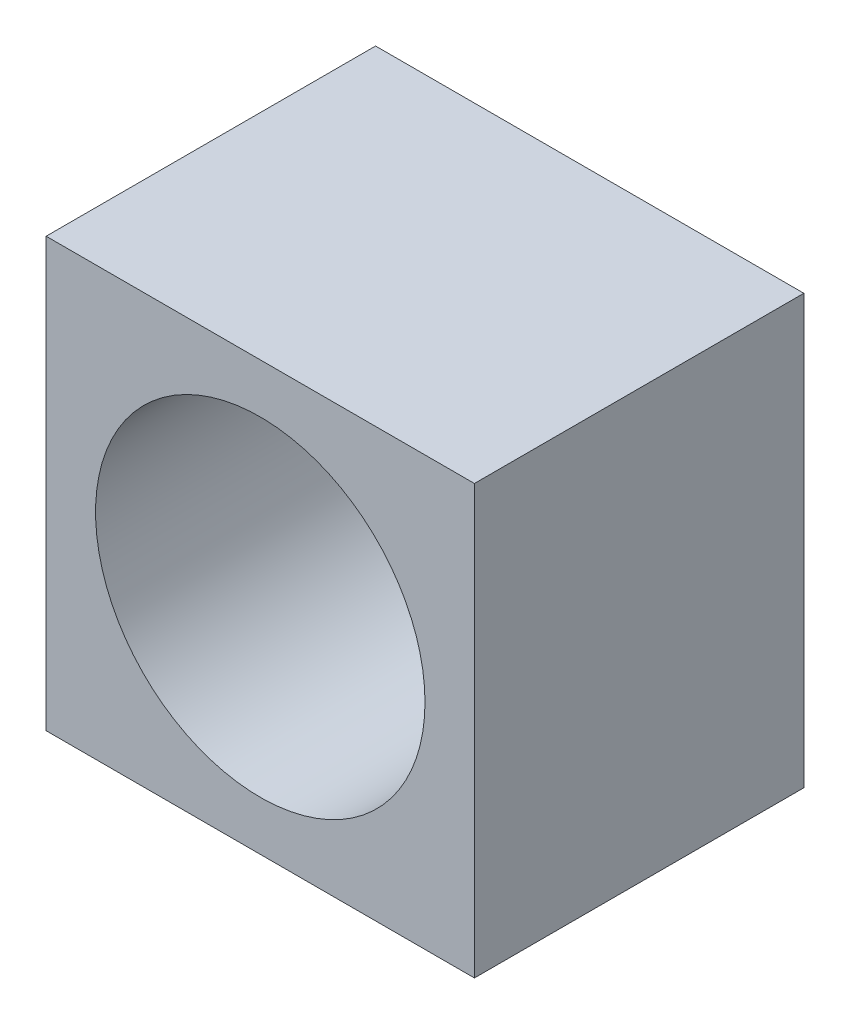
ISO-10303-21;
HEADER;
FILE_DESCRIPTION(('STEP AP214'),'2;1');
FILE_NAME('part.step','',(''),(''),'','','');
FILE_SCHEMA(('AUTOMOTIVE_DESIGN { 1 0 10303 214 1 1 1 1 }'));
ENDSEC;
DATA;
#1=APPLICATION_CONTEXT('core data for automotive mechanical design processes');
#2=APPLICATION_PROTOCOL_DEFINITION('international standard','automotive_design',2000,#1);
#3=PRODUCT_CONTEXT('',#1,'mechanical');
#4=PRODUCT('Part','Part','',(#3));
#5=PRODUCT_RELATED_PRODUCT_CATEGORY('part','',(#4));
#6=PRODUCT_DEFINITION_FORMATION('','',#4);
#7=PRODUCT_DEFINITION_CONTEXT('part definition',#1,'design');
#8=PRODUCT_DEFINITION('design','',#6,#7);
#9=PRODUCT_DEFINITION_SHAPE('','',#8);
#10=(LENGTH_UNIT() NAMED_UNIT(*) SI_UNIT(.MILLI.,.METRE.));
#11=(NAMED_UNIT(*) PLANE_ANGLE_UNIT() SI_UNIT($,.RADIAN.));
#12=(NAMED_UNIT(*) SI_UNIT($,.STERADIAN.) SOLID_ANGLE_UNIT());
#13=UNCERTAINTY_MEASURE_WITH_UNIT(LENGTH_MEASURE(1.E-05),#10,'distance_accuracy_value','');
#14=(GEOMETRIC_REPRESENTATION_CONTEXT(3) GLOBAL_UNCERTAINTY_ASSIGNED_CONTEXT((#13)) GLOBAL_UNIT_ASSIGNED_CONTEXT((#10,
#11,#12)) REPRESENTATION_CONTEXT('',''));
#15=CARTESIAN_POINT('',(0.,0.,0.));
#16=DIRECTION('',(0.,0.,1.));
#17=DIRECTION('',(1.,0.,0.));
#18=AXIS2_PLACEMENT_3D('',#15,#16,#17);
#19=CARTESIAN_POINT('',(0.,0.,10.));
#20=DIRECTION('',(0.,0.,1.));
#21=DIRECTION('',(1.,0.,0.));
#22=AXIS2_PLACEMENT_3D('',#19,#20,#21);
#23=PLANE('',#22);
#24=DIRECTION('',(0.,1.,0.));
#25=VECTOR('',#24,1.);
#26=CARTESIAN_POINT('',(6.5,6.5,10.));
#27=LINE('',#26,#25);
#28=CARTESIAN_POINT('',(6.5,-6.5,10.));
#29=VERTEX_POINT('',#28);
#30=CARTESIAN_POINT('',(6.5,6.5,10.));
#31=VERTEX_POINT('',#30);
#32=EDGE_CURVE('E91',#29,#31,#27,.T.);
#33=ORIENTED_EDGE('',*,*,#32,.T.);
#34=DIRECTION('',(-1.,0.,0.));
#35=VECTOR('',#34,1.);
#36=CARTESIAN_POINT('',(-6.5,6.5,10.));
#37=LINE('',#36,#35);
#38=CARTESIAN_POINT('',(-6.5,6.5,10.));
#39=VERTEX_POINT('',#38);
#40=EDGE_CURVE('E86',#31,#39,#37,.T.);
#41=ORIENTED_EDGE('',*,*,#40,.T.);
#42=DIRECTION('',(0.,-1.,0.));
#43=VECTOR('',#42,1.);
#44=CARTESIAN_POINT('',(-6.5,6.5,10.));
#45=LINE('',#44,#43);
#46=CARTESIAN_POINT('',(-6.5,-6.5,10.));
#47=VERTEX_POINT('',#46);
#48=EDGE_CURVE('E89',#39,#47,#45,.T.);
#49=ORIENTED_EDGE('',*,*,#48,.T.);
#50=DIRECTION('',(1.,0.,0.));
#51=VECTOR('',#50,1.);
#52=CARTESIAN_POINT('',(-6.5,-6.5,10.));
#53=LINE('',#52,#51);
#54=EDGE_CURVE('E56',#47,#29,#53,.T.);
#55=ORIENTED_EDGE('',*,*,#54,.T.);
#56=EDGE_LOOP('',(#33,#41,#49,#55));
#57=FACE_BOUND('',#56,.T.);
#58=CARTESIAN_POINT('',(0.,0.,10.));
#59=DIRECTION('',(0.,0.,1.));
#60=DIRECTION('',(1.,0.,0.));
#61=AXIS2_PLACEMENT_3D('',#58,#59,#60);
#62=CIRCLE('',#61,5.);
#63=CARTESIAN_POINT('',(5.,0.,10.));
#64=VERTEX_POINT('',#63);
#65=EDGE_CURVE('E106',#64,#64,#62,.T.);
#66=ORIENTED_EDGE('',*,*,#65,.F.);
#67=EDGE_LOOP('',(#66));
#68=FACE_BOUND('',#67,.T.);
#69=ADVANCED_FACE('F39',(#57,#68),#23,.T.);
#70=CARTESIAN_POINT('',(0.,0.,0.));
#71=DIRECTION('',(0.,0.,1.));
#72=DIRECTION('',(1.,0.,0.));
#73=AXIS2_PLACEMENT_3D('',#70,#71,#72);
#74=PLANE('',#73);
#75=DIRECTION('',(0.,1.,0.));
#76=VECTOR('',#75,1.);
#77=CARTESIAN_POINT('',(6.5,6.5,0.));
#78=LINE('',#77,#76);
#79=CARTESIAN_POINT('',(6.5,-6.5,0.));
#80=VERTEX_POINT('',#79);
#81=CARTESIAN_POINT('',(6.5,6.5,0.));
#82=VERTEX_POINT('',#81);
#83=EDGE_CURVE('E103',#80,#82,#78,.T.);
#84=ORIENTED_EDGE('',*,*,#83,.F.);
#85=DIRECTION('',(1.,0.,0.));
#86=VECTOR('',#85,1.);
#87=CARTESIAN_POINT('',(-6.5,-6.5,0.));
#88=LINE('',#87,#86);
#89=CARTESIAN_POINT('',(-6.5,-6.5,0.));
#90=VERTEX_POINT('',#89);
#91=EDGE_CURVE('E79',#90,#80,#88,.T.);
#92=ORIENTED_EDGE('',*,*,#91,.F.);
#93=DIRECTION('',(0.,-1.,0.));
#94=VECTOR('',#93,1.);
#95=CARTESIAN_POINT('',(-6.5,6.5,0.));
#96=LINE('',#95,#94);
#97=CARTESIAN_POINT('',(-6.5,6.5,0.));
#98=VERTEX_POINT('',#97);
#99=EDGE_CURVE('E73',#98,#90,#96,.T.);
#100=ORIENTED_EDGE('',*,*,#99,.F.);
#101=DIRECTION('',(-1.,0.,0.));
#102=VECTOR('',#101,1.);
#103=CARTESIAN_POINT('',(-6.5,6.5,0.));
#104=LINE('',#103,#102);
#105=EDGE_CURVE('E95',#82,#98,#104,.T.);
#106=ORIENTED_EDGE('',*,*,#105,.F.);
#107=EDGE_LOOP('',(#84,#92,#100,#106));
#108=FACE_BOUND('',#107,.T.);
#109=CARTESIAN_POINT('',(0.,0.,0.));
#110=DIRECTION('',(0.,0.,1.));
#111=DIRECTION('',(1.,0.,0.));
#112=AXIS2_PLACEMENT_3D('',#109,#110,#111);
#113=CIRCLE('',#112,5.);
#114=CARTESIAN_POINT('',(5.,0.,0.));
#115=VERTEX_POINT('',#114);
#116=EDGE_CURVE('E118',#115,#115,#113,.T.);
#117=ORIENTED_EDGE('',*,*,#116,.T.);
#118=EDGE_LOOP('',(#117));
#119=FACE_BOUND('',#118,.T.);
#120=ADVANCED_FACE('F114',(#108,#119),#74,.F.);
#121=CARTESIAN_POINT('',(6.5,6.5,10.));
#122=DIRECTION('',(-1.,0.,0.));
#123=DIRECTION('',(0.,-1.,0.));
#124=AXIS2_PLACEMENT_3D('',#121,#122,#123);
#125=PLANE('',#124);
#126=ORIENTED_EDGE('',*,*,#83,.T.);
#127=DIRECTION('',(0.,0.,-1.));
#128=VECTOR('',#127,1.);
#129=CARTESIAN_POINT('',(6.5,6.5,10.));
#130=LINE('',#129,#128);
#131=EDGE_CURVE('E11',#31,#82,#130,.T.);
#132=ORIENTED_EDGE('',*,*,#131,.F.);
#133=ORIENTED_EDGE('',*,*,#32,.F.);
#134=DIRECTION('',(0.,0.,-1.));
#135=VECTOR('',#134,1.);
#136=CARTESIAN_POINT('',(6.5,-6.5,10.));
#137=LINE('',#136,#135);
#138=EDGE_CURVE('E99',#29,#80,#137,.T.);
#139=ORIENTED_EDGE('',*,*,#138,.T.);
#140=EDGE_LOOP('',(#126,#132,#133,#139));
#141=FACE_BOUND('',#140,.T.);
#142=ADVANCED_FACE('F41',(#141),#125,.F.);
#143=CARTESIAN_POINT('',(-6.5,6.5,10.));
#144=DIRECTION('',(0.,-1.,0.));
#145=DIRECTION('',(0.,0.,-1.));
#146=AXIS2_PLACEMENT_3D('',#143,#144,#145);
#147=PLANE('',#146);
#148=ORIENTED_EDGE('',*,*,#105,.T.);
#149=DIRECTION('',(0.,0.,-1.));
#150=VECTOR('',#149,1.);
#151=CARTESIAN_POINT('',(-6.5,6.5,10.));
#152=LINE('',#151,#150);
#153=EDGE_CURVE('E48',#39,#98,#152,.T.);
#154=ORIENTED_EDGE('',*,*,#153,.F.);
#155=ORIENTED_EDGE('',*,*,#40,.F.);
#156=ORIENTED_EDGE('',*,*,#131,.T.);
#157=EDGE_LOOP('',(#148,#154,#155,#156));
#158=FACE_BOUND('',#157,.T.);
#159=ADVANCED_FACE('F94',(#158),#147,.F.);
#160=CARTESIAN_POINT('',(-6.5,6.5,10.));
#161=DIRECTION('',(1.,0.,0.));
#162=DIRECTION('',(0.,1.,0.));
#163=AXIS2_PLACEMENT_3D('',#160,#161,#162);
#164=PLANE('',#163);
#165=ORIENTED_EDGE('',*,*,#99,.T.);
#166=DIRECTION('',(0.,0.,-1.));
#167=VECTOR('',#166,1.);
#168=CARTESIAN_POINT('',(-6.5,-6.5,10.));
#169=LINE('',#168,#167);
#170=EDGE_CURVE('E96',#47,#90,#169,.T.);
#171=ORIENTED_EDGE('',*,*,#170,.F.);
#172=ORIENTED_EDGE('',*,*,#48,.F.);
#173=ORIENTED_EDGE('',*,*,#153,.T.);
#174=EDGE_LOOP('',(#165,#171,#172,#173));
#175=FACE_BOUND('',#174,.T.);
#176=ADVANCED_FACE('F97',(#175),#164,.F.);
#177=CARTESIAN_POINT('',(-6.5,-6.5,10.));
#178=DIRECTION('',(0.,1.,0.));
#179=DIRECTION('',(0.,0.,1.));
#180=AXIS2_PLACEMENT_3D('',#177,#178,#179);
#181=PLANE('',#180);
#182=ORIENTED_EDGE('',*,*,#91,.T.);
#183=ORIENTED_EDGE('',*,*,#138,.F.);
#184=ORIENTED_EDGE('',*,*,#54,.F.);
#185=ORIENTED_EDGE('',*,*,#170,.T.);
#186=EDGE_LOOP('',(#182,#183,#184,#185));
#187=FACE_BOUND('',#186,.T.);
#188=ADVANCED_FACE('F111',(#187),#181,.F.);
#189=CARTESIAN_POINT('',(0.,0.,10.));
#190=DIRECTION('',(0.,0.,-1.));
#191=DIRECTION('',(-1.,0.,0.));
#192=AXIS2_PLACEMENT_3D('',#189,#190,#191);
#193=CYLINDRICAL_SURFACE('',#192,5.);
#194=ORIENTED_EDGE('',*,*,#65,.T.);
#195=EDGE_LOOP('',(#194));
#196=FACE_BOUND('',#195,.T.);
#197=ORIENTED_EDGE('',*,*,#116,.F.);
#198=EDGE_LOOP('',(#197));
#199=FACE_BOUND('',#198,.T.);
#200=ADVANCED_FACE('F124',(#196,#199),#193,.F.);
#201=CLOSED_SHELL('',(#69,#120,#142,#159,#176,#188,#200));
#202=MANIFOLD_SOLID_BREP('B2',#201);
#203=ADVANCED_BREP_SHAPE_REPRESENTATION('',(#18,#202),#14);
#204=SHAPE_DEFINITION_REPRESENTATION(#9,#203);
ENDSEC;
END-ISO-10303-21;
